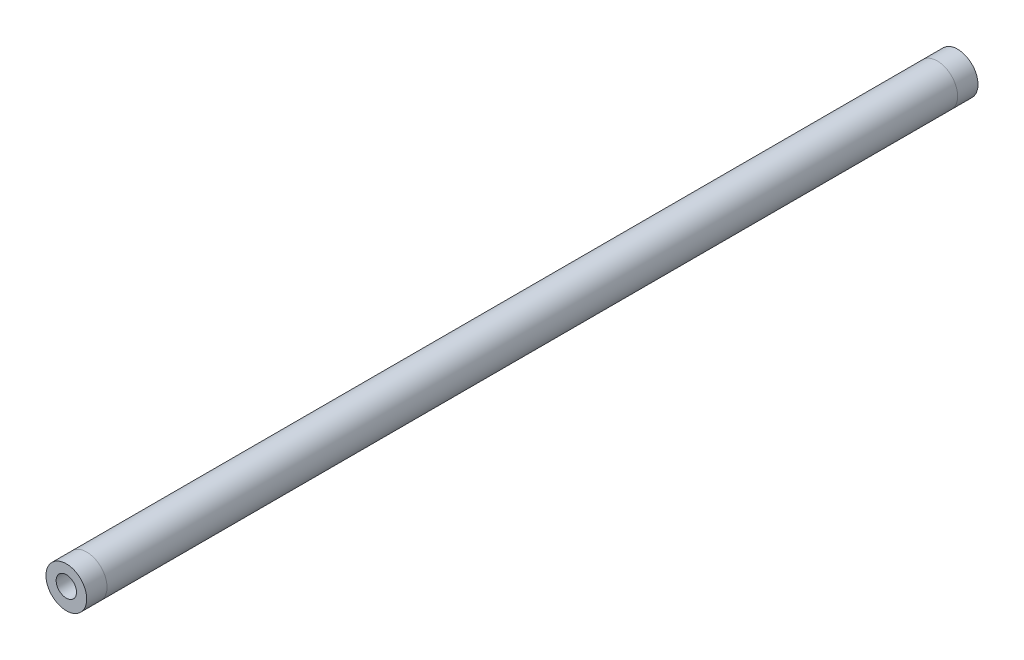
ISO-10303-21;
HEADER;
FILE_DESCRIPTION(('STEP AP214'),'2;1');
FILE_NAME('part.step','',(''),(''),'','','');
FILE_SCHEMA(('AUTOMOTIVE_DESIGN { 1 0 10303 214 1 1 1 1 }'));
ENDSEC;
DATA;
#1=APPLICATION_CONTEXT('core data for automotive mechanical design processes');
#2=APPLICATION_PROTOCOL_DEFINITION('international standard','automotive_design',2000,#1);
#3=PRODUCT_CONTEXT('',#1,'mechanical');
#4=PRODUCT('Part','Part','',(#3));
#5=PRODUCT_RELATED_PRODUCT_CATEGORY('part','',(#4));
#6=PRODUCT_DEFINITION_FORMATION('','',#4);
#7=PRODUCT_DEFINITION_CONTEXT('part definition',#1,'design');
#8=PRODUCT_DEFINITION('design','',#6,#7);
#9=PRODUCT_DEFINITION_SHAPE('','',#8);
#10=(LENGTH_UNIT() NAMED_UNIT(*) SI_UNIT(.MILLI.,.METRE.));
#11=(NAMED_UNIT(*) PLANE_ANGLE_UNIT() SI_UNIT($,.RADIAN.));
#12=(NAMED_UNIT(*) SI_UNIT($,.STERADIAN.) SOLID_ANGLE_UNIT());
#13=UNCERTAINTY_MEASURE_WITH_UNIT(LENGTH_MEASURE(1.E-05),#10,'distance_accuracy_value','');
#14=(GEOMETRIC_REPRESENTATION_CONTEXT(3) GLOBAL_UNCERTAINTY_ASSIGNED_CONTEXT((#13)) GLOBAL_UNIT_ASSIGNED_CONTEXT((#10,
#11,#12)) REPRESENTATION_CONTEXT('',''));
#15=CARTESIAN_POINT('',(0.,0.,0.));
#16=DIRECTION('',(0.,0.,1.));
#17=DIRECTION('',(1.,0.,0.));
#18=AXIS2_PLACEMENT_3D('',#15,#16,#17);
#19=CARTESIAN_POINT('',(0.,0.,-311.474428642138));
#20=DIRECTION('',(0.,0.,1.));
#21=DIRECTION('',(1.,0.,0.));
#22=AXIS2_PLACEMENT_3D('',#19,#20,#21);
#23=CYLINDRICAL_SURFACE('',#22,6.35);
#24=CARTESIAN_POINT('',(0.,0.,-293.5139164));
#25=DIRECTION('',(0.,0.,1.));
#26=DIRECTION('',(1.,0.,0.));
#27=AXIS2_PLACEMENT_3D('',#24,#25,#26);
#28=CIRCLE('',#27,6.35);
#29=CARTESIAN_POINT('',(6.35,0.,-293.5139164));
#30=VERTEX_POINT('',#29);
#31=EDGE_CURVE('E12',#30,#30,#28,.F.);
#32=ORIENTED_EDGE('',*,*,#31,.F.);
#33=EDGE_LOOP('',(#32));
#34=FACE_BOUND('',#33,.T.);
#35=CARTESIAN_POINT('',(0.,0.,-28.2448));
#36=DIRECTION('',(0.,0.,1.));
#37=DIRECTION('',(1.,0.,0.));
#38=AXIS2_PLACEMENT_3D('',#35,#36,#37);
#39=CIRCLE('',#38,6.35);
#40=CARTESIAN_POINT('',(6.35,0.,-28.2448));
#41=VERTEX_POINT('',#40);
#42=EDGE_CURVE('E77',#41,#41,#39,.T.);
#43=ORIENTED_EDGE('',*,*,#42,.F.);
#44=EDGE_LOOP('',(#43));
#45=FACE_BOUND('',#44,.T.);
#46=ADVANCED_FACE('F66',(#34,#45),#23,.T.);
#47=CARTESIAN_POINT('',(0.,0.,-28.2448));
#48=DIRECTION('',(0.,0.,1.));
#49=DIRECTION('',(1.,0.,0.));
#50=AXIS2_PLACEMENT_3D('',#47,#48,#49);
#51=PLANE('',#50);
#52=CARTESIAN_POINT('',(0.,0.,-28.2448));
#53=DIRECTION('',(0.,0.,1.));
#54=DIRECTION('',(1.,0.,0.));
#55=AXIS2_PLACEMENT_3D('',#52,#53,#54);
#56=CIRCLE('',#55,4.7625);
#57=CARTESIAN_POINT('',(4.7625,0.,-28.2448));
#58=VERTEX_POINT('',#57);
#59=EDGE_CURVE('E79',#58,#58,#56,.T.);
#60=ORIENTED_EDGE('',*,*,#59,.F.);
#61=EDGE_LOOP('',(#60));
#62=FACE_BOUND('',#61,.T.);
#63=ORIENTED_EDGE('',*,*,#42,.T.);
#64=EDGE_LOOP('',(#63));
#65=FACE_BOUND('',#64,.T.);
#66=ADVANCED_FACE('F84',(#62,#65),#51,.T.);
#67=CARTESIAN_POINT('',(0.,0.,-311.474428642138));
#68=DIRECTION('',(0.,0.,1.));
#69=DIRECTION('',(1.,0.,0.));
#70=AXIS2_PLACEMENT_3D('',#67,#68,#69);
#71=CYLINDRICAL_SURFACE('',#70,4.7625);
#72=CARTESIAN_POINT('',(0.,0.,-293.5139164));
#73=DIRECTION('',(0.,0.,1.));
#74=DIRECTION('',(1.,0.,0.));
#75=AXIS2_PLACEMENT_3D('',#72,#73,#74);
#76=CIRCLE('',#75,4.7625);
#77=CARTESIAN_POINT('',(4.7625,0.,-293.5139164));
#78=VERTEX_POINT('',#77);
#79=EDGE_CURVE('E69',#78,#78,#76,.F.);
#80=ORIENTED_EDGE('',*,*,#79,.T.);
#81=EDGE_LOOP('',(#80));
#82=FACE_BOUND('',#81,.T.);
#83=ORIENTED_EDGE('',*,*,#59,.T.);
#84=EDGE_LOOP('',(#83));
#85=FACE_BOUND('',#84,.T.);
#86=ADVANCED_FACE('F91',(#82,#85),#71,.F.);
#87=CARTESIAN_POINT('',(0.,0.,-293.5139164));
#88=DIRECTION('',(0.,0.,1.));
#89=DIRECTION('',(1.,0.,0.));
#90=AXIS2_PLACEMENT_3D('',#87,#88,#89);
#91=PLANE('',#90);
#92=ORIENTED_EDGE('',*,*,#31,.T.);
#93=EDGE_LOOP('',(#92));
#94=FACE_BOUND('',#93,.T.);
#95=ORIENTED_EDGE('',*,*,#79,.F.);
#96=EDGE_LOOP('',(#95));
#97=FACE_BOUND('',#96,.T.);
#98=ADVANCED_FACE('F96',(#94,#97),#91,.F.);
#99=CLOSED_SHELL('',(#46,#66,#86,#98));
#100=MANIFOLD_SOLID_BREP('B2',#99);
#101=CARTESIAN_POINT('',(0.,0.,-293.5139164));
#102=DIRECTION('',(0.,0.,1.));
#103=DIRECTION('',(1.,0.,0.));
#104=AXIS2_PLACEMENT_3D('',#101,#102,#103);
#105=PLANE('',#104);
#106=CARTESIAN_POINT('',(0.,0.,-293.5139164));
#107=DIRECTION('',(0.,0.,1.));
#108=DIRECTION('',(1.,0.,0.));
#109=AXIS2_PLACEMENT_3D('',#106,#107,#108);
#110=CIRCLE('',#109,6.35);
#111=CARTESIAN_POINT('',(6.35,0.,-293.5139164));
#112=VERTEX_POINT('',#111);
#113=EDGE_CURVE('E65',#112,#112,#110,.T.);
#114=ORIENTED_EDGE('',*,*,#113,.T.);
#115=EDGE_LOOP('',(#114));
#116=FACE_BOUND('',#115,.T.);
#117=CARTESIAN_POINT('',(0.,0.,-293.5139164));
#118=DIRECTION('',(0.,0.,1.));
#119=DIRECTION('',(1.,0.,0.));
#120=AXIS2_PLACEMENT_3D('',#117,#118,#119);
#121=CIRCLE('',#120,4.7625);
#122=CARTESIAN_POINT('',(-4.7625,0.,-293.5139164));
#123=VERTEX_POINT('',#122);
#124=EDGE_CURVE('E149',#123,#123,#121,.T.);
#125=ORIENTED_EDGE('',*,*,#124,.F.);
#126=EDGE_LOOP('',(#125));
#127=FACE_BOUND('',#126,.T.);
#128=ADVANCED_FACE('F135',(#116,#127),#105,.T.);
#129=CARTESIAN_POINT('',(0.,0.,-293.5139164));
#130=DIRECTION('',(0.,0.,-1.));
#131=DIRECTION('',(-1.,0.,0.));
#132=AXIS2_PLACEMENT_3D('',#129,#130,#131);
#133=CYLINDRICAL_SURFACE('',#132,6.35);
#134=ORIENTED_EDGE('',*,*,#113,.F.);
#135=EDGE_LOOP('',(#134));
#136=FACE_BOUND('',#135,.T.);
#137=CARTESIAN_POINT('',(0.,0.,-299.8639164));
#138=DIRECTION('',(0.,0.,1.));
#139=DIRECTION('',(1.,0.,0.));
#140=AXIS2_PLACEMENT_3D('',#137,#138,#139);
#141=CIRCLE('',#140,6.35);
#142=CARTESIAN_POINT('',(6.35,0.,-299.8639164));
#143=VERTEX_POINT('',#142);
#144=EDGE_CURVE('E147',#143,#143,#141,.T.);
#145=ORIENTED_EDGE('',*,*,#144,.T.);
#146=EDGE_LOOP('',(#145));
#147=FACE_BOUND('',#146,.T.);
#148=ADVANCED_FACE('F137',(#136,#147),#133,.T.);
#149=CARTESIAN_POINT('',(0.,0.235008438761634,-293.5139164));
#150=DIRECTION('',(0.,0.,-1.));
#151=DIRECTION('',(-1.,0.,0.));
#152=AXIS2_PLACEMENT_3D('',#149,#150,#151);
#153=CYLINDRICAL_SURFACE('',#152,3.175);
#154=CARTESIAN_POINT('',(0.,0.235008438761634,-299.8639164));
#155=DIRECTION('',(0.,0.,1.));
#156=DIRECTION('',(1.,0.,0.));
#157=AXIS2_PLACEMENT_3D('',#154,#155,#156);
#158=CIRCLE('',#157,3.175);
#159=CARTESIAN_POINT('',(3.175,0.235008438761634,-299.8639164));
#160=VERTEX_POINT('',#159);
#161=EDGE_CURVE('E139',#160,#160,#158,.T.);
#162=ORIENTED_EDGE('',*,*,#161,.F.);
#163=EDGE_LOOP('',(#162));
#164=FACE_BOUND('',#163,.T.);
#165=CARTESIAN_POINT('',(0.,0.235008438761634,-283.9889164));
#166=DIRECTION('',(0.,0.,1.));
#167=DIRECTION('',(1.,0.,0.));
#168=AXIS2_PLACEMENT_3D('',#165,#166,#167);
#169=CIRCLE('',#168,3.175);
#170=CARTESIAN_POINT('',(3.175,0.235008438761634,-283.9889164));
#171=VERTEX_POINT('',#170);
#172=EDGE_CURVE('E159',#171,#171,#169,.T.);
#173=ORIENTED_EDGE('',*,*,#172,.T.);
#174=EDGE_LOOP('',(#173));
#175=FACE_BOUND('',#174,.T.);
#176=ADVANCED_FACE('F164',(#164,#175),#153,.F.);
#177=CARTESIAN_POINT('',(0.,0.,-299.8639164));
#178=DIRECTION('',(0.,0.,1.));
#179=DIRECTION('',(1.,0.,0.));
#180=AXIS2_PLACEMENT_3D('',#177,#178,#179);
#181=PLANE('',#180);
#182=ORIENTED_EDGE('',*,*,#144,.F.);
#183=EDGE_LOOP('',(#182));
#184=FACE_BOUND('',#183,.T.);
#185=ORIENTED_EDGE('',*,*,#161,.T.);
#186=EDGE_LOOP('',(#185));
#187=FACE_BOUND('',#186,.T.);
#188=ADVANCED_FACE('F169',(#184,#187),#181,.F.);
#189=CARTESIAN_POINT('',(0.,0.,-283.9889164));
#190=DIRECTION('',(0.,0.,1.));
#191=DIRECTION('',(1.,0.,0.));
#192=AXIS2_PLACEMENT_3D('',#189,#190,#191);
#193=PLANE('',#192);
#194=CARTESIAN_POINT('',(0.,0.,-283.9889164));
#195=DIRECTION('',(0.,0.,1.));
#196=DIRECTION('',(1.,0.,0.));
#197=AXIS2_PLACEMENT_3D('',#194,#195,#196);
#198=CIRCLE('',#197,4.7625);
#199=CARTESIAN_POINT('',(-4.7625,0.,-283.9889164));
#200=VERTEX_POINT('',#199);
#201=EDGE_CURVE('E152',#200,#200,#198,.T.);
#202=ORIENTED_EDGE('',*,*,#201,.T.);
#203=EDGE_LOOP('',(#202));
#204=FACE_BOUND('',#203,.T.);
#205=ORIENTED_EDGE('',*,*,#172,.F.);
#206=EDGE_LOOP('',(#205));
#207=FACE_BOUND('',#206,.T.);
#208=ADVANCED_FACE('F166',(#204,#207),#193,.T.);
#209=CARTESIAN_POINT('',(0.,0.,-283.9889164));
#210=DIRECTION('',(0.,0.,-1.));
#211=DIRECTION('',(-1.,0.,0.));
#212=AXIS2_PLACEMENT_3D('',#209,#210,#211);
#213=CYLINDRICAL_SURFACE('',#212,4.7625);
#214=CARTESIAN_POINT('',(-4.7625,0.,-283.9889164));
#215=CARTESIAN_POINT('',(-4.7625,0.,-284.08813515));
#216=CARTESIAN_POINT('',(-4.7625,0.,-284.1873539));
#217=CARTESIAN_POINT('',(-4.7625,0.,-284.3857914));
#218=CARTESIAN_POINT('',(-4.7625,0.,-284.48501015));
#219=CARTESIAN_POINT('',(-4.7625,0.,-284.68344765));
#220=CARTESIAN_POINT('',(-4.7625,0.,-284.7826664));
#221=CARTESIAN_POINT('',(-4.7625,0.,-284.9811039));
#222=CARTESIAN_POINT('',(-4.7625,0.,-285.08032265));
#223=CARTESIAN_POINT('',(-4.7625,0.,-285.27876015));
#224=CARTESIAN_POINT('',(-4.7625,0.,-285.3779789));
#225=CARTESIAN_POINT('',(-4.7625,0.,-285.5764164));
#226=CARTESIAN_POINT('',(-4.7625,0.,-285.67563515));
#227=CARTESIAN_POINT('',(-4.7625,0.,-285.87407265));
#228=CARTESIAN_POINT('',(-4.7625,0.,-285.9732914));
#229=CARTESIAN_POINT('',(-4.7625,0.,-286.1717289));
#230=CARTESIAN_POINT('',(-4.7625,0.,-286.27094765));
#231=CARTESIAN_POINT('',(-4.7625,0.,-286.46938515));
#232=CARTESIAN_POINT('',(-4.7625,0.,-286.5686039));
#233=CARTESIAN_POINT('',(-4.7625,0.,-286.7670414));
#234=CARTESIAN_POINT('',(-4.7625,0.,-286.86626015));
#235=CARTESIAN_POINT('',(-4.7625,0.,-287.06469765));
#236=CARTESIAN_POINT('',(-4.7625,0.,-287.1639164));
#237=CARTESIAN_POINT('',(-4.7625,0.,-287.3623539));
#238=CARTESIAN_POINT('',(-4.7625,0.,-287.46157265));
#239=CARTESIAN_POINT('',(-4.7625,0.,-287.66001015));
#240=CARTESIAN_POINT('',(-4.7625,0.,-287.7592289));
#241=CARTESIAN_POINT('',(-4.7625,0.,-287.9576664));
#242=CARTESIAN_POINT('',(-4.7625,0.,-288.05688515));
#243=CARTESIAN_POINT('',(-4.7625,0.,-288.25532265));
#244=CARTESIAN_POINT('',(-4.7625,0.,-288.3545414));
#245=CARTESIAN_POINT('',(-4.7625,0.,-288.5529789));
#246=CARTESIAN_POINT('',(-4.7625,0.,-288.65219765));
#247=CARTESIAN_POINT('',(-4.7625,0.,-288.85063515));
#248=CARTESIAN_POINT('',(-4.7625,0.,-288.9498539));
#249=CARTESIAN_POINT('',(-4.7625,0.,-289.1482914));
#250=CARTESIAN_POINT('',(-4.7625,0.,-289.24751015));
#251=CARTESIAN_POINT('',(-4.7625,0.,-289.44594765));
#252=CARTESIAN_POINT('',(-4.7625,0.,-289.5451664));
#253=CARTESIAN_POINT('',(-4.7625,0.,-289.7436039));
#254=CARTESIAN_POINT('',(-4.7625,0.,-289.84282265));
#255=CARTESIAN_POINT('',(-4.7625,0.,-290.04126015));
#256=CARTESIAN_POINT('',(-4.7625,0.,-290.1404789));
#257=CARTESIAN_POINT('',(-4.7625,0.,-290.3389164));
#258=CARTESIAN_POINT('',(-4.7625,0.,-290.43813515));
#259=CARTESIAN_POINT('',(-4.7625,0.,-290.63657265));
#260=CARTESIAN_POINT('',(-4.7625,0.,-290.7357914));
#261=CARTESIAN_POINT('',(-4.7625,0.,-290.9342289));
#262=CARTESIAN_POINT('',(-4.7625,0.,-291.03344765));
#263=CARTESIAN_POINT('',(-4.7625,0.,-291.23188515));
#264=CARTESIAN_POINT('',(-4.7625,0.,-291.3311039));
#265=CARTESIAN_POINT('',(-4.7625,0.,-291.5295414));
#266=CARTESIAN_POINT('',(-4.7625,0.,-291.62876015));
#267=CARTESIAN_POINT('',(-4.7625,0.,-291.82719765));
#268=CARTESIAN_POINT('',(-4.7625,0.,-291.9264164));
#269=CARTESIAN_POINT('',(-4.7625,0.,-292.1248539));
#270=CARTESIAN_POINT('',(-4.7625,0.,-292.22407265));
#271=CARTESIAN_POINT('',(-4.7625,0.,-292.42251015));
#272=CARTESIAN_POINT('',(-4.7625,0.,-292.5217289));
#273=CARTESIAN_POINT('',(-4.7625,0.,-292.7201664));
#274=CARTESIAN_POINT('',(-4.7625,0.,-292.81938515));
#275=CARTESIAN_POINT('',(-4.7625,0.,-293.01782265));
#276=CARTESIAN_POINT('',(-4.7625,0.,-293.1170414));
#277=CARTESIAN_POINT('',(-4.7625,0.,-293.3154789));
#278=CARTESIAN_POINT('',(-4.7625,0.,-293.41469765));
#279=CARTESIAN_POINT('',(-4.7625,0.,-293.5139164));
#280=B_SPLINE_CURVE_WITH_KNOTS('',3,(#214,#215,#216,#217,#218,#219,#220,#221,#222,#223,#224,
#225,#226,#227,#228,#229,#230,#231,#232,#233,#234,#235,#236,#237,#238,#239,#240,#241,#242,#243,
#244,#245,#246,#247,#248,#249,#250,#251,#252,#253,#254,#255,#256,#257,#258,#259,#260,#261,#262,
#263,#264,#265,#266,#267,#268,#269,#270,#271,#272,#273,#274,#275,#276,#277,#278,#279),
.UNSPECIFIED.,.F.,.F.,(4,2,2,2,2,2,2,2,2,2,2,2,2,2,2,2,2,2,2,2,2,2,2,2,2,2,2,2,2,2,2,2,4),(0.,
0.297656249999945,0.595312499999945,0.892968749999945,1.19062499999995,1.48828124999995,
1.78593749999995,2.08359374999995,2.38124999999995,2.67890624999995,2.97656249999995,
3.27421874999995,3.57187499999995,3.86953124999995,4.16718749999995,4.46484374999995,
4.76249999999995,5.06015624999995,5.35781249999995,5.65546874999995,5.95312499999995,
6.25078124999995,6.54843749999995,6.84609374999995,7.14374999999995,7.44140624999995,
7.73906249999995,8.03671874999995,8.33437499999995,8.63203124999995,8.92968749999995,
9.22734374999995,9.52499999999995),.UNSPECIFIED.);
#281=EDGE_CURVE('BSEAM168',#200,#123,#280,.T.);
#282=ORIENTED_EDGE('',*,*,#201,.F.);
#283=ORIENTED_EDGE('',*,*,#124,.T.);
#284=ORIENTED_EDGE('',*,*,#281,.T.);
#285=ORIENTED_EDGE('',*,*,#281,.F.);
#286=EDGE_LOOP('',(#282,#284,#283,#285));
#287=FACE_BOUND('',#286,.T.);
#288=ADVANCED_FACE('F168',(#287),#213,.T.);
#289=CLOSED_SHELL('',(#128,#148,#176,#188,#208,#288));
#290=MANIFOLD_SOLID_BREP('B7',#289);
#291=CARTESIAN_POINT('',(0.,0.,-28.2448));
#292=DIRECTION('',(0.,0.,1.));
#293=DIRECTION('',(1.,0.,0.));
#294=AXIS2_PLACEMENT_3D('',#291,#292,#293);
#295=CYLINDRICAL_SURFACE('',#294,6.35);
#296=CARTESIAN_POINT('',(0.,0.,-28.2448));
#297=DIRECTION('',(0.,0.,1.));
#298=DIRECTION('',(1.,0.,0.));
#299=AXIS2_PLACEMENT_3D('',#296,#297,#298);
#300=CIRCLE('',#299,6.35);
#301=CARTESIAN_POINT('',(6.35,0.,-28.2448));
#302=VERTEX_POINT('',#301);
#303=EDGE_CURVE('E134',#302,#302,#300,.T.);
#304=ORIENTED_EDGE('',*,*,#303,.T.);
#305=EDGE_LOOP('',(#304));
#306=FACE_BOUND('',#305,.T.);
#307=CARTESIAN_POINT('',(0.,0.,-21.8948));
#308=DIRECTION('',(0.,0.,1.));
#309=DIRECTION('',(1.,0.,0.));
#310=AXIS2_PLACEMENT_3D('',#307,#308,#309);
#311=CIRCLE('',#310,6.35);
#312=CARTESIAN_POINT('',(6.35,0.,-21.8948));
#313=VERTEX_POINT('',#312);
#314=EDGE_CURVE('E247',#313,#313,#311,.T.);
#315=ORIENTED_EDGE('',*,*,#314,.F.);
#316=EDGE_LOOP('',(#315));
#317=FACE_BOUND('',#316,.T.);
#318=ADVANCED_FACE('F236',(#306,#317),#295,.T.);
#319=CARTESIAN_POINT('',(0.,0.235008438761634,-28.2448));
#320=DIRECTION('',(0.,0.,1.));
#321=DIRECTION('',(1.,0.,0.));
#322=AXIS2_PLACEMENT_3D('',#319,#320,#321);
#323=CYLINDRICAL_SURFACE('',#322,3.175);
#324=CARTESIAN_POINT('',(0.,0.235008438761634,-21.8948));
#325=DIRECTION('',(0.,0.,1.));
#326=DIRECTION('',(1.,0.,0.));
#327=AXIS2_PLACEMENT_3D('',#324,#325,#326);
#328=CIRCLE('',#327,3.175);
#329=CARTESIAN_POINT('',(3.175,0.235008438761634,-21.8948));
#330=VERTEX_POINT('',#329);
#331=EDGE_CURVE('E239',#330,#330,#328,.T.);
#332=ORIENTED_EDGE('',*,*,#331,.T.);
#333=EDGE_LOOP('',(#332));
#334=FACE_BOUND('',#333,.T.);
#335=CARTESIAN_POINT('',(0.,0.235008438761634,-37.7698));
#336=DIRECTION('',(0.,0.,1.));
#337=DIRECTION('',(1.,0.,0.));
#338=AXIS2_PLACEMENT_3D('',#335,#336,#337);
#339=CIRCLE('',#338,3.175);
#340=CARTESIAN_POINT('',(3.175,0.235008438761634,-37.7698));
#341=VERTEX_POINT('',#340);
#342=EDGE_CURVE('E259',#341,#341,#339,.T.);
#343=ORIENTED_EDGE('',*,*,#342,.F.);
#344=EDGE_LOOP('',(#343));
#345=FACE_BOUND('',#344,.T.);
#346=ADVANCED_FACE('F267',(#334,#345),#323,.F.);
#347=CARTESIAN_POINT('',(0.,0.,-28.2448));
#348=DIRECTION('',(0.,0.,1.));
#349=DIRECTION('',(1.,0.,0.));
#350=AXIS2_PLACEMENT_3D('',#347,#348,#349);
#351=PLANE('',#350);
#352=CARTESIAN_POINT('',(0.,0.,-28.2448));
#353=DIRECTION('',(0.,0.,1.));
#354=DIRECTION('',(1.,0.,0.));
#355=AXIS2_PLACEMENT_3D('',#352,#353,#354);
#356=CIRCLE('',#355,4.7625);
#357=CARTESIAN_POINT('',(4.7625,0.,-28.2448));
#358=VERTEX_POINT('',#357);
#359=EDGE_CURVE('E249',#358,#358,#356,.T.);
#360=ORIENTED_EDGE('',*,*,#359,.T.);
#361=EDGE_LOOP('',(#360));
#362=FACE_BOUND('',#361,.T.);
#363=ORIENTED_EDGE('',*,*,#303,.F.);
#364=EDGE_LOOP('',(#363));
#365=FACE_BOUND('',#364,.T.);
#366=ADVANCED_FACE('F269',(#362,#365),#351,.F.);
#367=CARTESIAN_POINT('',(0.,0.,-21.8948));
#368=DIRECTION('',(0.,0.,1.));
#369=DIRECTION('',(1.,0.,0.));
#370=AXIS2_PLACEMENT_3D('',#367,#368,#369);
#371=PLANE('',#370);
#372=ORIENTED_EDGE('',*,*,#314,.T.);
#373=EDGE_LOOP('',(#372));
#374=FACE_BOUND('',#373,.T.);
#375=ORIENTED_EDGE('',*,*,#331,.F.);
#376=EDGE_LOOP('',(#375));
#377=FACE_BOUND('',#376,.T.);
#378=ADVANCED_FACE('F275',(#374,#377),#371,.T.);
#379=CARTESIAN_POINT('',(0.,0.,-37.7698));
#380=DIRECTION('',(0.,0.,1.));
#381=DIRECTION('',(1.,0.,0.));
#382=AXIS2_PLACEMENT_3D('',#379,#380,#381);
#383=CYLINDRICAL_SURFACE('',#382,4.7625);
#384=CARTESIAN_POINT('',(0.,0.,-37.7698));
#385=DIRECTION('',(0.,0.,1.));
#386=DIRECTION('',(1.,0.,0.));
#387=AXIS2_PLACEMENT_3D('',#384,#385,#386);
#388=CIRCLE('',#387,4.7625);
#389=CARTESIAN_POINT('',(4.7625,0.,-37.7698));
#390=VERTEX_POINT('',#389);
#391=EDGE_CURVE('E252',#390,#390,#388,.T.);
#392=CARTESIAN_POINT('',(4.7625,0.,-37.7698));
#393=CARTESIAN_POINT('',(4.7625,0.,-37.67058125));
#394=CARTESIAN_POINT('',(4.7625,0.,-37.5713625));
#395=CARTESIAN_POINT('',(4.7625,0.,-37.372925));
#396=CARTESIAN_POINT('',(4.7625,0.,-37.27370625));
#397=CARTESIAN_POINT('',(4.7625,0.,-37.07526875));
#398=CARTESIAN_POINT('',(4.7625,0.,-36.97605));
#399=CARTESIAN_POINT('',(4.7625,0.,-36.7776125));
#400=CARTESIAN_POINT('',(4.7625,0.,-36.67839375));
#401=CARTESIAN_POINT('',(4.7625,0.,-36.47995625));
#402=CARTESIAN_POINT('',(4.7625,0.,-36.3807375));
#403=CARTESIAN_POINT('',(4.7625,0.,-36.1823));
#404=CARTESIAN_POINT('',(4.7625,0.,-36.08308125));
#405=CARTESIAN_POINT('',(4.7625,0.,-35.88464375));
#406=CARTESIAN_POINT('',(4.7625,0.,-35.785425));
#407=CARTESIAN_POINT('',(4.7625,0.,-35.5869875));
#408=CARTESIAN_POINT('',(4.7625,0.,-35.48776875));
#409=CARTESIAN_POINT('',(4.7625,0.,-35.28933125));
#410=CARTESIAN_POINT('',(4.7625,0.,-35.1901125));
#411=CARTESIAN_POINT('',(4.7625,0.,-34.991675));
#412=CARTESIAN_POINT('',(4.7625,0.,-34.89245625));
#413=CARTESIAN_POINT('',(4.7625,0.,-34.69401875));
#414=CARTESIAN_POINT('',(4.7625,0.,-34.5948));
#415=CARTESIAN_POINT('',(4.7625,0.,-34.3963625));
#416=CARTESIAN_POINT('',(4.7625,0.,-34.29714375));
#417=CARTESIAN_POINT('',(4.7625,0.,-34.09870625));
#418=CARTESIAN_POINT('',(4.7625,0.,-33.9994875));
#419=CARTESIAN_POINT('',(4.7625,0.,-33.80105));
#420=CARTESIAN_POINT('',(4.7625,0.,-33.70183125));
#421=CARTESIAN_POINT('',(4.7625,0.,-33.50339375));
#422=CARTESIAN_POINT('',(4.7625,0.,-33.404175));
#423=CARTESIAN_POINT('',(4.7625,0.,-33.2057375));
#424=CARTESIAN_POINT('',(4.7625,0.,-33.10651875));
#425=CARTESIAN_POINT('',(4.7625,0.,-32.90808125));
#426=CARTESIAN_POINT('',(4.7625,0.,-32.8088625));
#427=CARTESIAN_POINT('',(4.7625,0.,-32.610425));
#428=CARTESIAN_POINT('',(4.7625,0.,-32.51120625));
#429=CARTESIAN_POINT('',(4.7625,0.,-32.31276875));
#430=CARTESIAN_POINT('',(4.7625,0.,-32.21355));
#431=CARTESIAN_POINT('',(4.7625,0.,-32.0151125));
#432=CARTESIAN_POINT('',(4.7625,0.,-31.91589375));
#433=CARTESIAN_POINT('',(4.7625,0.,-31.71745625));
#434=CARTESIAN_POINT('',(4.7625,0.,-31.6182375));
#435=CARTESIAN_POINT('',(4.7625,0.,-31.4198));
#436=CARTESIAN_POINT('',(4.7625,0.,-31.32058125));
#437=CARTESIAN_POINT('',(4.7625,0.,-31.12214375));
#438=CARTESIAN_POINT('',(4.7625,0.,-31.022925));
#439=CARTESIAN_POINT('',(4.7625,0.,-30.8244875));
#440=CARTESIAN_POINT('',(4.7625,0.,-30.72526875));
#441=CARTESIAN_POINT('',(4.7625,0.,-30.52683125));
#442=CARTESIAN_POINT('',(4.7625,0.,-30.4276125));
#443=CARTESIAN_POINT('',(4.7625,0.,-30.229175));
#444=CARTESIAN_POINT('',(4.7625,0.,-30.12995625));
#445=CARTESIAN_POINT('',(4.7625,0.,-29.93151875));
#446=CARTESIAN_POINT('',(4.7625,0.,-29.8323));
#447=CARTESIAN_POINT('',(4.7625,0.,-29.6338625));
#448=CARTESIAN_POINT('',(4.7625,0.,-29.53464375));
#449=CARTESIAN_POINT('',(4.7625,0.,-29.33620625));
#450=CARTESIAN_POINT('',(4.7625,0.,-29.2369875));
#451=CARTESIAN_POINT('',(4.7625,0.,-29.03855));
#452=CARTESIAN_POINT('',(4.7625,0.,-28.93933125));
#453=CARTESIAN_POINT('',(4.7625,0.,-28.74089375));
#454=CARTESIAN_POINT('',(4.7625,0.,-28.641675));
#455=CARTESIAN_POINT('',(4.7625,0.,-28.4432375));
#456=CARTESIAN_POINT('',(4.7625,0.,-28.34401875));
#457=CARTESIAN_POINT('',(4.7625,0.,-28.2448));
#458=B_SPLINE_CURVE_WITH_KNOTS('',3,(#392,#393,#394,#395,#396,#397,#398,#399,#400,#401,#402,
#403,#404,#405,#406,#407,#408,#409,#410,#411,#412,#413,#414,#415,#416,#417,#418,#419,#420,#421,
#422,#423,#424,#425,#426,#427,#428,#429,#430,#431,#432,#433,#434,#435,#436,#437,#438,#439,#440,
#441,#442,#443,#444,#445,#446,#447,#448,#449,#450,#451,#452,#453,#454,#455,#456,#457),
.UNSPECIFIED.,.F.,.F.,(4,2,2,2,2,2,2,2,2,2,2,2,2,2,2,2,2,2,2,2,2,2,2,2,2,2,2,2,2,2,2,2,4),(0.,
0.297656249999993,0.595312499999993,0.892968749999994,1.19062499999999,1.48828124999999,
1.78593749999999,2.08359374999999,2.38124999999999,2.67890624999999,2.97656249999999,
3.27421874999999,3.571875,3.86953125,4.1671875,4.46484375,4.7625,5.06015625,5.3578125,
5.65546875,5.953125,6.25078125,6.5484375,6.84609375,7.14375,7.44140625,7.7390625,8.03671875,
8.334375,8.63203125,8.9296875,9.22734375,9.525),.UNSPECIFIED.);
#459=EDGE_CURVE('BSEAM280',#390,#358,#458,.T.);
#460=ORIENTED_EDGE('',*,*,#391,.T.);
#461=ORIENTED_EDGE('',*,*,#359,.F.);
#462=ORIENTED_EDGE('',*,*,#459,.T.);
#463=ORIENTED_EDGE('',*,*,#459,.F.);
#464=EDGE_LOOP('',(#460,#462,#461,#463));
#465=FACE_BOUND('',#464,.T.);
#466=ADVANCED_FACE('F280',(#465),#383,.T.);
#467=CARTESIAN_POINT('',(0.,0.,-37.7698));
#468=DIRECTION('',(0.,0.,1.));
#469=DIRECTION('',(1.,0.,0.));
#470=AXIS2_PLACEMENT_3D('',#467,#468,#469);
#471=PLANE('',#470);
#472=ORIENTED_EDGE('',*,*,#342,.T.);
#473=EDGE_LOOP('',(#472));
#474=FACE_BOUND('',#473,.T.);
#475=ORIENTED_EDGE('',*,*,#391,.F.);
#476=EDGE_LOOP('',(#475));
#477=FACE_BOUND('',#476,.T.);
#478=ADVANCED_FACE('F264',(#474,#477),#471,.F.);
#479=CLOSED_SHELL('',(#318,#346,#366,#378,#466,#478));
#480=MANIFOLD_SOLID_BREP('B60',#479);
#481=ADVANCED_BREP_SHAPE_REPRESENTATION('',(#18,#100,#290,#480),#14);
#482=SHAPE_DEFINITION_REPRESENTATION(#9,#481);
ENDSEC;
END-ISO-10303-21;
